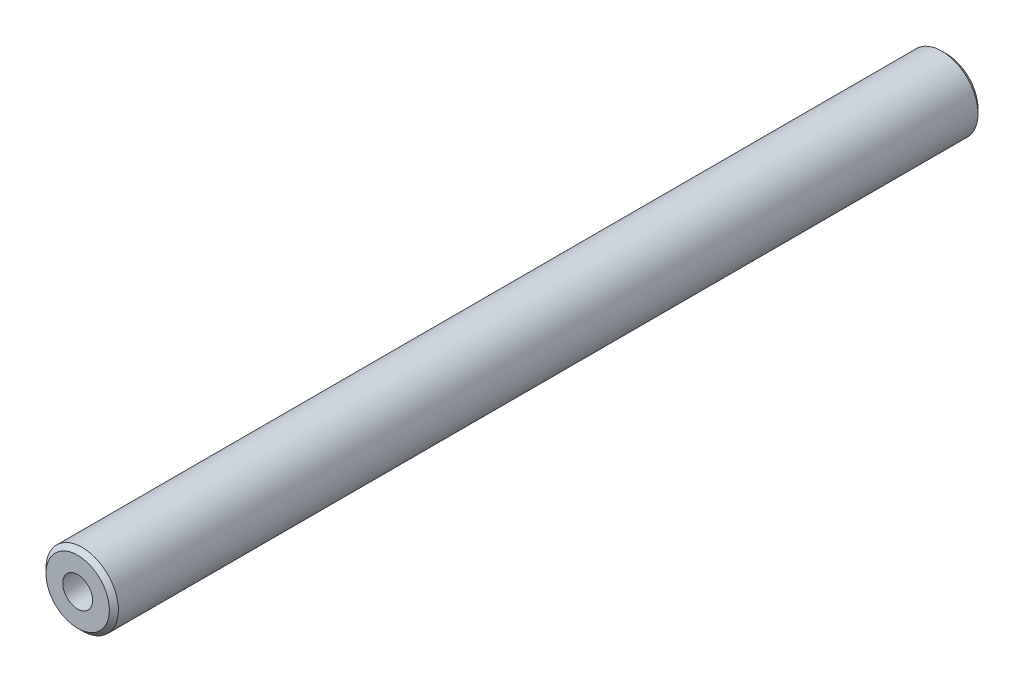
ISO-10303-21;
HEADER;
FILE_DESCRIPTION(('STEP AP214'),'2;1');
FILE_NAME('part.step','',(''),(''),'','','');
FILE_SCHEMA(('AUTOMOTIVE_DESIGN { 1 0 10303 214 1 1 1 1 }'));
ENDSEC;
DATA;
#1=APPLICATION_CONTEXT('core data for automotive mechanical design processes');
#2=APPLICATION_PROTOCOL_DEFINITION('international standard','automotive_design',2000,#1);
#3=PRODUCT_CONTEXT('',#1,'mechanical');
#4=PRODUCT('Part','Part','',(#3));
#5=PRODUCT_RELATED_PRODUCT_CATEGORY('part','',(#4));
#6=PRODUCT_DEFINITION_FORMATION('','',#4);
#7=PRODUCT_DEFINITION_CONTEXT('part definition',#1,'design');
#8=PRODUCT_DEFINITION('design','',#6,#7);
#9=PRODUCT_DEFINITION_SHAPE('','',#8);
#10=(LENGTH_UNIT() NAMED_UNIT(*) SI_UNIT(.MILLI.,.METRE.));
#11=(NAMED_UNIT(*) PLANE_ANGLE_UNIT() SI_UNIT($,.RADIAN.));
#12=(NAMED_UNIT(*) SI_UNIT($,.STERADIAN.) SOLID_ANGLE_UNIT());
#13=UNCERTAINTY_MEASURE_WITH_UNIT(LENGTH_MEASURE(1.E-05),#10,'distance_accuracy_value','');
#14=(GEOMETRIC_REPRESENTATION_CONTEXT(3) GLOBAL_UNCERTAINTY_ASSIGNED_CONTEXT((#13)) GLOBAL_UNIT_ASSIGNED_CONTEXT((#10,
#11,#12)) REPRESENTATION_CONTEXT('',''));
#15=CARTESIAN_POINT('',(0.,0.,0.));
#16=DIRECTION('',(0.,0.,1.));
#17=DIRECTION('',(1.,0.,0.));
#18=AXIS2_PLACEMENT_3D('',#15,#16,#17);
#19=CARTESIAN_POINT('',(0.,0.,84.4999999999345));
#20=DIRECTION('',(0.,0.,1.));
#21=DIRECTION('',(1.,0.,0.));
#22=AXIS2_PLACEMENT_3D('',#19,#20,#21);
#23=CONICAL_SURFACE('',#22,1.64999999992688,1.02974425861523);
#24=CARTESIAN_POINT('',(-5.6843418860808E-11,0.,83.5085799785418));
#25=VERTEX_POINT('',#24);
#26=VERTEX_LOOP('',#25);
#27=FACE_BOUND('',#26,.T.);
#28=CARTESIAN_POINT('',(0.,0.,84.5));
#29=DIRECTION('',(0.,0.,1.));
#30=DIRECTION('',(1.,0.,0.));
#31=AXIS2_PLACEMENT_3D('',#28,#29,#30);
#32=CIRCLE('',#31,1.64999999999999);
#33=CARTESIAN_POINT('',(1.64999999999999,0.,84.5));
#34=VERTEX_POINT('',#33);
#35=EDGE_CURVE('E37',#34,#34,#32,.T.);
#36=ORIENTED_EDGE('',*,*,#35,.T.);
#37=EDGE_LOOP('',(#36));
#38=FACE_BOUND('',#37,.T.);
#39=ADVANCED_FACE('F17',(#27,#38),#23,.F.);
#40=CARTESIAN_POINT('',(0.,0.,11.5000000000123));
#41=DIRECTION('',(0.,0.,-1.));
#42=DIRECTION('',(-1.,0.,0.));
#43=AXIS2_PLACEMENT_3D('',#40,#41,#42);
#44=CONICAL_SURFACE('',#43,1.64999999992688,1.02974425842273);
#45=CARTESIAN_POINT('',(0.,-8.52643634123347E-11,12.491420021604));
#46=VERTEX_POINT('',#45);
#47=VERTEX_LOOP('',#46);
#48=FACE_BOUND('',#47,.T.);
#49=CARTESIAN_POINT('',(0.,0.,11.5));
#50=DIRECTION('',(0.,0.,-1.));
#51=DIRECTION('',(0.,1.,0.));
#52=AXIS2_PLACEMENT_3D('',#49,#50,#51);
#53=CIRCLE('',#52,1.64999999999999);
#54=CARTESIAN_POINT('',(0.,1.64999999999999,11.5));
#55=VERTEX_POINT('',#54);
#56=EDGE_CURVE('E39',#55,#55,#53,.T.);
#57=ORIENTED_EDGE('',*,*,#56,.T.);
#58=EDGE_LOOP('',(#57));
#59=FACE_BOUND('',#58,.T.);
#60=ADVANCED_FACE('F34',(#48,#59),#44,.F.);
#61=CARTESIAN_POINT('',(0.,0.,96.));
#62=DIRECTION('',(0.,0.,1.));
#63=DIRECTION('',(1.,0.,0.));
#64=AXIS2_PLACEMENT_3D('',#61,#62,#63);
#65=CYLINDRICAL_SURFACE('',#64,1.64999999999999);
#66=CARTESIAN_POINT('',(0.,0.,96.));
#67=DIRECTION('',(0.,0.,1.));
#68=DIRECTION('',(1.,0.,0.));
#69=AXIS2_PLACEMENT_3D('',#66,#67,#68);
#70=CIRCLE('',#69,1.64999999999999);
#71=CARTESIAN_POINT('',(1.64999999999999,0.,96.));
#72=VERTEX_POINT('',#71);
#73=EDGE_CURVE('E20',#72,#72,#70,.F.);
#74=ORIENTED_EDGE('',*,*,#73,.F.);
#75=EDGE_LOOP('',(#74));
#76=FACE_BOUND('',#75,.T.);
#77=ORIENTED_EDGE('',*,*,#35,.F.);
#78=EDGE_LOOP('',(#77));
#79=FACE_BOUND('',#78,.T.);
#80=ADVANCED_FACE('F59',(#76,#79),#65,.F.);
#81=CARTESIAN_POINT('',(0.,0.,0.));
#82=DIRECTION('',(0.,0.,-1.));
#83=DIRECTION('',(0.,1.,0.));
#84=AXIS2_PLACEMENT_3D('',#81,#82,#83);
#85=CYLINDRICAL_SURFACE('',#84,1.64999999999999);
#86=ORIENTED_EDGE('',*,*,#56,.F.);
#87=EDGE_LOOP('',(#86));
#88=FACE_BOUND('',#87,.T.);
#89=CARTESIAN_POINT('',(0.,0.,0.));
#90=DIRECTION('',(0.,0.,-1.));
#91=DIRECTION('',(0.,1.,0.));
#92=AXIS2_PLACEMENT_3D('',#89,#90,#91);
#93=CIRCLE('',#92,1.64999999999999);
#94=CARTESIAN_POINT('',(0.,1.64999999999999,0.));
#95=VERTEX_POINT('',#94);
#96=EDGE_CURVE('E50',#95,#95,#93,.T.);
#97=ORIENTED_EDGE('',*,*,#96,.T.);
#98=EDGE_LOOP('',(#97));
#99=FACE_BOUND('',#98,.T.);
#100=ADVANCED_FACE('F61',(#88,#99),#85,.F.);
#101=CARTESIAN_POINT('',(0.,0.,96.));
#102=DIRECTION('',(0.,0.,1.));
#103=DIRECTION('',(1.,0.,0.));
#104=AXIS2_PLACEMENT_3D('',#101,#102,#103);
#105=PLANE('',#104);
#106=CARTESIAN_POINT('',(0.,0.,96.0000000000036));
#107=DIRECTION('',(0.,0.,-1.));
#108=DIRECTION('',(0.,1.,0.));
#109=AXIS2_PLACEMENT_3D('',#106,#107,#108);
#110=CIRCLE('',#109,3.50000000008777);
#111=CARTESIAN_POINT('',(0.,3.50000000008777,96.0000000000036));
#112=VERTEX_POINT('',#111);
#113=EDGE_CURVE('E48',#112,#112,#110,.T.);
#114=ORIENTED_EDGE('',*,*,#113,.F.);
#115=EDGE_LOOP('',(#114));
#116=FACE_BOUND('',#115,.T.);
#117=ORIENTED_EDGE('',*,*,#73,.T.);
#118=EDGE_LOOP('',(#117));
#119=FACE_BOUND('',#118,.T.);
#120=ADVANCED_FACE('F57',(#116,#119),#105,.T.);
#121=CARTESIAN_POINT('',(0.,0.,0.));
#122=DIRECTION('',(0.,0.,1.));
#123=DIRECTION('',(1.,0.,0.));
#124=AXIS2_PLACEMENT_3D('',#121,#122,#123);
#125=PLANE('',#124);
#126=CARTESIAN_POINT('',(0.,0.,0.));
#127=DIRECTION('',(0.,0.,1.));
#128=DIRECTION('',(1.,0.,0.));
#129=AXIS2_PLACEMENT_3D('',#126,#127,#128);
#130=CIRCLE('',#129,3.50000000008777);
#131=CARTESIAN_POINT('',(3.50000000008777,0.,0.));
#132=VERTEX_POINT('',#131);
#133=EDGE_CURVE('E45',#132,#132,#130,.T.);
#134=ORIENTED_EDGE('',*,*,#133,.F.);
#135=EDGE_LOOP('',(#134));
#136=FACE_BOUND('',#135,.T.);
#137=ORIENTED_EDGE('',*,*,#96,.F.);
#138=EDGE_LOOP('',(#137));
#139=FACE_BOUND('',#138,.T.);
#140=ADVANCED_FACE('F85',(#136,#139),#125,.F.);
#141=CARTESIAN_POINT('',(0.,0.,95.5000000000723));
#142=DIRECTION('',(0.,0.,-1.));
#143=DIRECTION('',(0.,1.,0.));
#144=AXIS2_PLACEMENT_3D('',#141,#142,#143);
#145=CONICAL_SURFACE('',#144,4.0000000000191,0.785398163397448);
#146=CARTESIAN_POINT('',(0.,0.,95.5));
#147=DIRECTION('',(0.,0.,-1.));
#148=DIRECTION('',(-1.,0.,0.));
#149=AXIS2_PLACEMENT_3D('',#146,#147,#148);
#150=CIRCLE('',#149,4.);
#151=CARTESIAN_POINT('',(-4.,0.,95.5));
#152=VERTEX_POINT('',#151);
#153=EDGE_CURVE('E26',#152,#152,#150,.T.);
#154=ORIENTED_EDGE('',*,*,#153,.F.);
#155=EDGE_LOOP('',(#154));
#156=FACE_BOUND('',#155,.T.);
#157=ORIENTED_EDGE('',*,*,#113,.T.);
#158=EDGE_LOOP('',(#157));
#159=FACE_BOUND('',#158,.T.);
#160=ADVANCED_FACE('F78',(#156,#159),#145,.T.);
#161=CARTESIAN_POINT('',(0.,0.,0.499999999931333));
#162=DIRECTION('',(0.,0.,1.));
#163=DIRECTION('',(1.,0.,0.));
#164=AXIS2_PLACEMENT_3D('',#161,#162,#163);
#165=CONICAL_SURFACE('',#164,3.99999999996226,0.785398163340605);
#166=CARTESIAN_POINT('',(0.,0.,0.5));
#167=DIRECTION('',(0.,0.,-1.));
#168=DIRECTION('',(-1.,0.,0.));
#169=AXIS2_PLACEMENT_3D('',#166,#167,#168);
#170=CIRCLE('',#169,4.);
#171=CARTESIAN_POINT('',(-4.,0.,0.5));
#172=VERTEX_POINT('',#171);
#173=EDGE_CURVE('E10',#172,#172,#170,.F.);
#174=ORIENTED_EDGE('',*,*,#173,.F.);
#175=EDGE_LOOP('',(#174));
#176=FACE_BOUND('',#175,.T.);
#177=ORIENTED_EDGE('',*,*,#133,.T.);
#178=EDGE_LOOP('',(#177));
#179=FACE_BOUND('',#178,.T.);
#180=ADVANCED_FACE('F72',(#176,#179),#165,.T.);
#181=CARTESIAN_POINT('',(0.,0.,96.));
#182=DIRECTION('',(0.,0.,-1.));
#183=DIRECTION('',(-1.,0.,0.));
#184=AXIS2_PLACEMENT_3D('',#181,#182,#183);
#185=CYLINDRICAL_SURFACE('',#184,4.);
#186=ORIENTED_EDGE('',*,*,#173,.T.);
#187=EDGE_LOOP('',(#186));
#188=FACE_BOUND('',#187,.T.);
#189=ORIENTED_EDGE('',*,*,#153,.T.);
#190=EDGE_LOOP('',(#189));
#191=FACE_BOUND('',#190,.T.);
#192=ADVANCED_FACE('F70',(#188,#191),#185,.T.);
#193=CLOSED_SHELL('',(#39,#60,#80,#100,#120,#140,#160,#180,#192));
#194=MANIFOLD_SOLID_BREP('B1',#193);
#195=ADVANCED_BREP_SHAPE_REPRESENTATION('',(#18,#194),#14);
#196=SHAPE_DEFINITION_REPRESENTATION(#9,#195);
ENDSEC;
END-ISO-10303-21;
